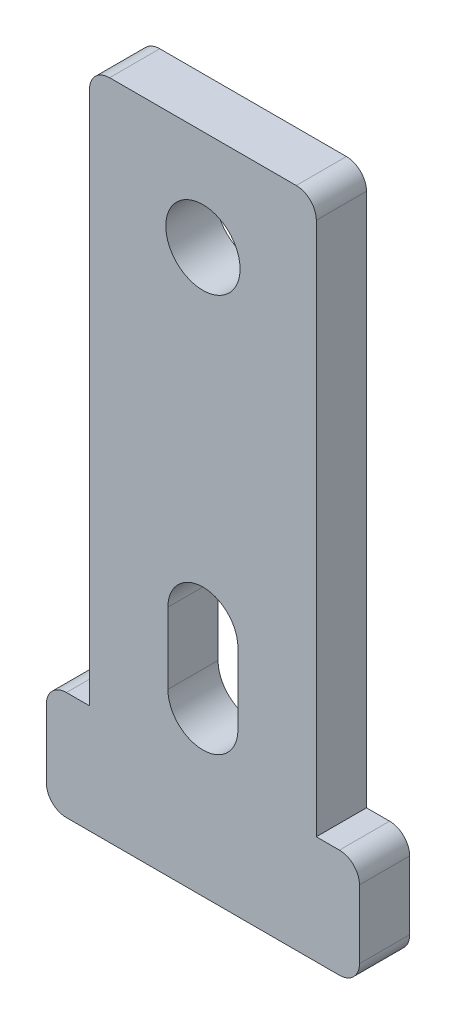
ISO-10303-21;
HEADER;
FILE_DESCRIPTION(('STEP AP214'),'2;1');
FILE_NAME('part.step','',(''),(''),'','','');
FILE_SCHEMA(('AUTOMOTIVE_DESIGN { 1 0 10303 214 1 1 1 1 }'));
ENDSEC;
DATA;
#1=APPLICATION_CONTEXT('core data for automotive mechanical design processes');
#2=APPLICATION_PROTOCOL_DEFINITION('international standard','automotive_design',2000,#1);
#3=PRODUCT_CONTEXT('',#1,'mechanical');
#4=PRODUCT('Part','Part','',(#3));
#5=PRODUCT_RELATED_PRODUCT_CATEGORY('part','',(#4));
#6=PRODUCT_DEFINITION_FORMATION('','',#4);
#7=PRODUCT_DEFINITION_CONTEXT('part definition',#1,'design');
#8=PRODUCT_DEFINITION('design','',#6,#7);
#9=PRODUCT_DEFINITION_SHAPE('','',#8);
#10=(LENGTH_UNIT() NAMED_UNIT(*) SI_UNIT(.MILLI.,.METRE.));
#11=(NAMED_UNIT(*) PLANE_ANGLE_UNIT() SI_UNIT($,.RADIAN.));
#12=(NAMED_UNIT(*) SI_UNIT($,.STERADIAN.) SOLID_ANGLE_UNIT());
#13=UNCERTAINTY_MEASURE_WITH_UNIT(LENGTH_MEASURE(1.E-05),#10,'distance_accuracy_value','');
#14=(GEOMETRIC_REPRESENTATION_CONTEXT(3) GLOBAL_UNCERTAINTY_ASSIGNED_CONTEXT((#13)) GLOBAL_UNIT_ASSIGNED_CONTEXT((#10,
#11,#12)) REPRESENTATION_CONTEXT('',''));
#15=CARTESIAN_POINT('',(0.,0.,0.));
#16=DIRECTION('',(0.,0.,1.));
#17=DIRECTION('',(1.,0.,0.));
#18=AXIS2_PLACEMENT_3D('',#15,#16,#17);
#19=CARTESIAN_POINT('',(0.,-11.1,2.5));
#20=DIRECTION('',(0.,1.,0.));
#21=DIRECTION('',(0.,0.,1.));
#22=AXIS2_PLACEMENT_3D('',#19,#20,#21);
#23=PLANE('',#22);
#24=DIRECTION('',(1.,0.,0.));
#25=VECTOR('',#24,1.);
#26=CARTESIAN_POINT('',(0.,-11.1,2.5));
#27=LINE('',#26,#25);
#28=CARTESIAN_POINT('',(5.65,-11.1,2.5));
#29=VERTEX_POINT('',#28);
#30=CARTESIAN_POINT('',(6.8,-11.1,2.5));
#31=VERTEX_POINT('',#30);
#32=EDGE_CURVE('E209',#29,#31,#27,.T.);
#33=ORIENTED_EDGE('',*,*,#32,.T.);
#34=DIRECTION('',(0.,0.,-1.));
#35=VECTOR('',#34,1.);
#36=CARTESIAN_POINT('',(6.8,-11.1,2.5));
#37=LINE('',#36,#35);
#38=CARTESIAN_POINT('',(6.8,-11.1,0.));
#39=VERTEX_POINT('',#38);
#40=EDGE_CURVE('E358',#31,#39,#37,.T.);
#41=ORIENTED_EDGE('',*,*,#40,.T.);
#42=DIRECTION('',(1.,0.,0.));
#43=VECTOR('',#42,1.);
#44=CARTESIAN_POINT('',(0.,-11.1,0.));
#45=LINE('',#44,#43);
#46=CARTESIAN_POINT('',(5.65,-11.1,0.));
#47=VERTEX_POINT('',#46);
#48=EDGE_CURVE('E257',#47,#39,#45,.T.);
#49=ORIENTED_EDGE('',*,*,#48,.F.);
#50=DIRECTION('',(0.,0.,-1.));
#51=VECTOR('',#50,1.);
#52=CARTESIAN_POINT('',(5.65,-11.1,2.5));
#53=LINE('',#52,#51);
#54=EDGE_CURVE('E290',#29,#47,#53,.T.);
#55=ORIENTED_EDGE('',*,*,#54,.F.);
#56=EDGE_LOOP('',(#33,#41,#49,#55));
#57=FACE_BOUND('',#56,.T.);
#58=ADVANCED_FACE('F41',(#57),#23,.T.);
#59=CARTESIAN_POINT('',(5.65,0.,2.5));
#60=DIRECTION('',(-1.,0.,0.));
#61=DIRECTION('',(0.,0.,1.));
#62=AXIS2_PLACEMENT_3D('',#59,#60,#61);
#63=PLANE('',#62);
#64=DIRECTION('',(0.,1.,0.));
#65=VECTOR('',#64,1.);
#66=CARTESIAN_POINT('',(5.65,0.,0.));
#67=LINE('',#66,#65);
#68=CARTESIAN_POINT('',(5.65,15.5,0.));
#69=VERTEX_POINT('',#68);
#70=EDGE_CURVE('E261',#47,#69,#67,.T.);
#71=ORIENTED_EDGE('',*,*,#70,.T.);
#72=DIRECTION('',(0.,0.,-1.));
#73=VECTOR('',#72,1.);
#74=CARTESIAN_POINT('',(5.65,15.5,2.5));
#75=LINE('',#74,#73);
#76=CARTESIAN_POINT('',(5.65,15.5,2.5));
#77=VERTEX_POINT('',#76);
#78=EDGE_CURVE('E50',#69,#77,#75,.F.);
#79=ORIENTED_EDGE('',*,*,#78,.T.);
#80=DIRECTION('',(0.,1.,0.));
#81=VECTOR('',#80,1.);
#82=CARTESIAN_POINT('',(5.65,0.,2.5));
#83=LINE('',#82,#81);
#84=EDGE_CURVE('E213',#29,#77,#83,.T.);
#85=ORIENTED_EDGE('',*,*,#84,.F.);
#86=ORIENTED_EDGE('',*,*,#54,.T.);
#87=EDGE_LOOP('',(#71,#79,#85,#86));
#88=FACE_BOUND('',#87,.T.);
#89=ADVANCED_FACE('F372',(#88),#63,.F.);
#90=CARTESIAN_POINT('',(0.,16.5,2.5));
#91=DIRECTION('',(0.,1.,0.));
#92=DIRECTION('',(0.,0.,1.));
#93=AXIS2_PLACEMENT_3D('',#90,#91,#92);
#94=PLANE('',#93);
#95=DIRECTION('',(1.,0.,0.));
#96=VECTOR('',#95,1.);
#97=CARTESIAN_POINT('',(0.,16.5,2.5));
#98=LINE('',#97,#96);
#99=CARTESIAN_POINT('',(-4.65,16.5,2.5));
#100=VERTEX_POINT('',#99);
#101=CARTESIAN_POINT('',(4.65,16.5,2.5));
#102=VERTEX_POINT('',#101);
#103=EDGE_CURVE('E217',#100,#102,#98,.T.);
#104=ORIENTED_EDGE('',*,*,#103,.T.);
#105=DIRECTION('',(0.,0.,-1.));
#106=VECTOR('',#105,1.);
#107=CARTESIAN_POINT('',(4.65,16.5,0.));
#108=LINE('',#107,#106);
#109=CARTESIAN_POINT('',(4.65,16.5,0.));
#110=VERTEX_POINT('',#109);
#111=EDGE_CURVE('E365',#102,#110,#108,.T.);
#112=ORIENTED_EDGE('',*,*,#111,.T.);
#113=DIRECTION('',(1.,0.,0.));
#114=VECTOR('',#113,1.);
#115=CARTESIAN_POINT('',(0.,16.5,0.));
#116=LINE('',#115,#114);
#117=CARTESIAN_POINT('',(-4.65,16.5,0.));
#118=VERTEX_POINT('',#117);
#119=EDGE_CURVE('E265',#118,#110,#116,.T.);
#120=ORIENTED_EDGE('',*,*,#119,.F.);
#121=DIRECTION('',(0.,0.,-1.));
#122=VECTOR('',#121,1.);
#123=CARTESIAN_POINT('',(-4.65,16.5,2.5));
#124=LINE('',#123,#122);
#125=EDGE_CURVE('E362',#118,#100,#124,.F.);
#126=ORIENTED_EDGE('',*,*,#125,.T.);
#127=EDGE_LOOP('',(#104,#112,#120,#126));
#128=FACE_BOUND('',#127,.T.);
#129=ADVANCED_FACE('F383',(#128),#94,.T.);
#130=CARTESIAN_POINT('',(-5.65,0.,2.5));
#131=DIRECTION('',(-1.,0.,0.));
#132=DIRECTION('',(0.,0.,1.));
#133=AXIS2_PLACEMENT_3D('',#130,#131,#132);
#134=PLANE('',#133);
#135=DIRECTION('',(0.,1.,0.));
#136=VECTOR('',#135,1.);
#137=CARTESIAN_POINT('',(-5.65,0.,2.5));
#138=LINE('',#137,#136);
#139=CARTESIAN_POINT('',(-5.65,-11.1,2.5));
#140=VERTEX_POINT('',#139);
#141=CARTESIAN_POINT('',(-5.65,15.5,2.5));
#142=VERTEX_POINT('',#141);
#143=EDGE_CURVE('E221',#140,#142,#138,.T.);
#144=ORIENTED_EDGE('',*,*,#143,.T.);
#145=DIRECTION('',(0.,0.,-1.));
#146=VECTOR('',#145,1.);
#147=CARTESIAN_POINT('',(-5.65,15.5,2.5));
#148=LINE('',#147,#146);
#149=CARTESIAN_POINT('',(-5.65,15.5,0.));
#150=VERTEX_POINT('',#149);
#151=EDGE_CURVE('E11',#142,#150,#148,.T.);
#152=ORIENTED_EDGE('',*,*,#151,.T.);
#153=DIRECTION('',(0.,1.,0.));
#154=VECTOR('',#153,1.);
#155=CARTESIAN_POINT('',(-5.65,0.,0.));
#156=LINE('',#155,#154);
#157=CARTESIAN_POINT('',(-5.65,-11.1,0.));
#158=VERTEX_POINT('',#157);
#159=EDGE_CURVE('E269',#158,#150,#156,.T.);
#160=ORIENTED_EDGE('',*,*,#159,.F.);
#161=DIRECTION('',(0.,0.,-1.));
#162=VECTOR('',#161,1.);
#163=CARTESIAN_POINT('',(-5.65,-11.1,2.5));
#164=LINE('',#163,#162);
#165=EDGE_CURVE('E180',#140,#158,#164,.T.);
#166=ORIENTED_EDGE('',*,*,#165,.F.);
#167=EDGE_LOOP('',(#144,#152,#160,#166));
#168=FACE_BOUND('',#167,.T.);
#169=ADVANCED_FACE('F392',(#168),#134,.T.);
#170=CARTESIAN_POINT('',(0.,-11.1,2.5));
#171=DIRECTION('',(0.,1.,0.));
#172=DIRECTION('',(0.,0.,1.));
#173=AXIS2_PLACEMENT_3D('',#170,#171,#172);
#174=PLANE('',#173);
#175=DIRECTION('',(1.,0.,0.));
#176=VECTOR('',#175,1.);
#177=CARTESIAN_POINT('',(0.,-11.1,0.));
#178=LINE('',#177,#176);
#179=CARTESIAN_POINT('',(-6.8,-11.1,0.));
#180=VERTEX_POINT('',#179);
#181=EDGE_CURVE('E273',#180,#158,#178,.T.);
#182=ORIENTED_EDGE('',*,*,#181,.F.);
#183=DIRECTION('',(0.,0.,-1.));
#184=VECTOR('',#183,1.);
#185=CARTESIAN_POINT('',(-6.8,-11.1,2.5));
#186=LINE('',#185,#184);
#187=CARTESIAN_POINT('',(-6.8,-11.1,2.5));
#188=VERTEX_POINT('',#187);
#189=EDGE_CURVE('E349',#180,#188,#186,.F.);
#190=ORIENTED_EDGE('',*,*,#189,.T.);
#191=DIRECTION('',(1.,0.,0.));
#192=VECTOR('',#191,1.);
#193=CARTESIAN_POINT('',(0.,-11.1,2.5));
#194=LINE('',#193,#192);
#195=EDGE_CURVE('E225',#188,#140,#194,.T.);
#196=ORIENTED_EDGE('',*,*,#195,.T.);
#197=ORIENTED_EDGE('',*,*,#165,.T.);
#198=EDGE_LOOP('',(#182,#190,#196,#197));
#199=FACE_BOUND('',#198,.T.);
#200=ADVANCED_FACE('F535',(#199),#174,.T.);
#201=CARTESIAN_POINT('',(-7.8,0.,2.5));
#202=DIRECTION('',(-1.,0.,0.));
#203=DIRECTION('',(0.,0.,1.));
#204=AXIS2_PLACEMENT_3D('',#201,#202,#203);
#205=PLANE('',#204);
#206=DIRECTION('',(0.,1.,0.));
#207=VECTOR('',#206,1.);
#208=CARTESIAN_POINT('',(-7.8,0.,0.));
#209=LINE('',#208,#207);
#210=CARTESIAN_POINT('',(-7.8,-15.5,0.));
#211=VERTEX_POINT('',#210);
#212=CARTESIAN_POINT('',(-7.8,-12.1,0.));
#213=VERTEX_POINT('',#212);
#214=EDGE_CURVE('E276',#211,#213,#209,.T.);
#215=ORIENTED_EDGE('',*,*,#214,.F.);
#216=DIRECTION('',(0.,0.,-1.));
#217=VECTOR('',#216,1.);
#218=CARTESIAN_POINT('',(-7.8,-15.5,2.5));
#219=LINE('',#218,#217);
#220=CARTESIAN_POINT('',(-7.8,-15.5,2.5));
#221=VERTEX_POINT('',#220);
#222=EDGE_CURVE('E329',#211,#221,#219,.F.);
#223=ORIENTED_EDGE('',*,*,#222,.T.);
#224=DIRECTION('',(0.,1.,0.));
#225=VECTOR('',#224,1.);
#226=CARTESIAN_POINT('',(-7.8,0.,2.5));
#227=LINE('',#226,#225);
#228=CARTESIAN_POINT('',(-7.8,-12.1,2.5));
#229=VERTEX_POINT('',#228);
#230=EDGE_CURVE('E228',#221,#229,#227,.T.);
#231=ORIENTED_EDGE('',*,*,#230,.T.);
#232=DIRECTION('',(0.,0.,-1.));
#233=VECTOR('',#232,1.);
#234=CARTESIAN_POINT('',(-7.8,-12.1,2.5));
#235=LINE('',#234,#233);
#236=EDGE_CURVE('E325',#229,#213,#235,.T.);
#237=ORIENTED_EDGE('',*,*,#236,.T.);
#238=EDGE_LOOP('',(#215,#223,#231,#237));
#239=FACE_BOUND('',#238,.T.);
#240=ADVANCED_FACE('F404',(#239),#205,.T.);
#241=CARTESIAN_POINT('',(0.,-16.5,2.5));
#242=DIRECTION('',(0.,-1.,0.));
#243=DIRECTION('',(0.,0.,-1.));
#244=AXIS2_PLACEMENT_3D('',#241,#242,#243);
#245=PLANE('',#244);
#246=DIRECTION('',(-1.,0.,0.));
#247=VECTOR('',#246,1.);
#248=CARTESIAN_POINT('',(0.,-16.5,2.5));
#249=LINE('',#248,#247);
#250=CARTESIAN_POINT('',(6.8,-16.5,2.5));
#251=VERTEX_POINT('',#250);
#252=CARTESIAN_POINT('',(-6.8,-16.5,2.5));
#253=VERTEX_POINT('',#252);
#254=EDGE_CURVE('E232',#251,#253,#249,.T.);
#255=ORIENTED_EDGE('',*,*,#254,.T.);
#256=DIRECTION('',(0.,0.,-1.));
#257=VECTOR('',#256,1.);
#258=CARTESIAN_POINT('',(-6.8,-16.5,2.5));
#259=LINE('',#258,#257);
#260=CARTESIAN_POINT('',(-6.8,-16.5,0.));
#261=VERTEX_POINT('',#260);
#262=EDGE_CURVE('E303',#253,#261,#259,.T.);
#263=ORIENTED_EDGE('',*,*,#262,.T.);
#264=DIRECTION('',(-1.,0.,0.));
#265=VECTOR('',#264,1.);
#266=CARTESIAN_POINT('',(0.,-16.5,0.));
#267=LINE('',#266,#265);
#268=CARTESIAN_POINT('',(6.8,-16.5,0.));
#269=VERTEX_POINT('',#268);
#270=EDGE_CURVE('E280',#269,#261,#267,.T.);
#271=ORIENTED_EDGE('',*,*,#270,.F.);
#272=DIRECTION('',(0.,0.,-1.));
#273=VECTOR('',#272,1.);
#274=CARTESIAN_POINT('',(6.8,-16.5,2.5));
#275=LINE('',#274,#273);
#276=EDGE_CURVE('E293',#269,#251,#275,.F.);
#277=ORIENTED_EDGE('',*,*,#276,.T.);
#278=EDGE_LOOP('',(#255,#263,#271,#277));
#279=FACE_BOUND('',#278,.T.);
#280=ADVANCED_FACE('F413',(#279),#245,.T.);
#281=CARTESIAN_POINT('',(0.,-4.89338309242175,2.5));
#282=DIRECTION('',(0.,0.,-1.));
#283=DIRECTION('',(-1.,0.,0.));
#284=AXIS2_PLACEMENT_3D('',#281,#282,#283);
#285=CYLINDRICAL_SURFACE('',#284,1.74449319310327);
#286=CARTESIAN_POINT('',(0.,-4.89338309242175,0.));
#287=DIRECTION('',(0.,0.,1.));
#288=DIRECTION('',(1.,0.,0.));
#289=AXIS2_PLACEMENT_3D('',#286,#287,#288);
#290=CIRCLE('',#289,1.74449319310327);
#291=CARTESIAN_POINT('',(1.74449319310327,-4.89338309242175,0.));
#292=VERTEX_POINT('',#291);
#293=CARTESIAN_POINT('',(-1.74449319310327,-4.89338309242175,0.));
#294=VERTEX_POINT('',#293);
#295=EDGE_CURVE('E174',#292,#294,#290,.T.);
#296=ORIENTED_EDGE('',*,*,#295,.F.);
#297=DIRECTION('',(0.,0.,-1.));
#298=VECTOR('',#297,1.);
#299=CARTESIAN_POINT('',(1.74449319310327,-4.89338309242175,2.5));
#300=LINE('',#299,#298);
#301=CARTESIAN_POINT('',(1.74449319310327,-4.89338309242175,2.5));
#302=VERTEX_POINT('',#301);
#303=EDGE_CURVE('E169',#302,#292,#300,.T.);
#304=ORIENTED_EDGE('',*,*,#303,.F.);
#305=CARTESIAN_POINT('',(0.,-4.89338309242175,2.5));
#306=DIRECTION('',(0.,0.,1.));
#307=DIRECTION('',(1.,0.,0.));
#308=AXIS2_PLACEMENT_3D('',#305,#306,#307);
#309=CIRCLE('',#308,1.74449319310327);
#310=CARTESIAN_POINT('',(-1.74449319310327,-4.89338309242175,2.5));
#311=VERTEX_POINT('',#310);
#312=EDGE_CURVE('E172',#302,#311,#309,.T.);
#313=ORIENTED_EDGE('',*,*,#312,.T.);
#314=DIRECTION('',(0.,0.,-1.));
#315=VECTOR('',#314,1.);
#316=CARTESIAN_POINT('',(-1.74449319310327,-4.89338309242175,2.5));
#317=LINE('',#316,#315);
#318=EDGE_CURVE('E239',#311,#294,#317,.T.);
#319=ORIENTED_EDGE('',*,*,#318,.T.);
#320=EDGE_LOOP('',(#296,#304,#313,#319));
#321=FACE_BOUND('',#320,.T.);
#322=ADVANCED_FACE('F171',(#321),#285,.F.);
#323=CARTESIAN_POINT('',(1.74449319310327,0.,2.5));
#324=DIRECTION('',(-1.,0.,0.));
#325=DIRECTION('',(0.,-1.,0.));
#326=AXIS2_PLACEMENT_3D('',#323,#324,#325);
#327=PLANE('',#326);
#328=DIRECTION('',(0.,1.,0.));
#329=VECTOR('',#328,1.);
#330=CARTESIAN_POINT('',(1.74449319310327,0.,0.));
#331=LINE('',#330,#329);
#332=CARTESIAN_POINT('',(1.74449319310327,-8.43596580277362,0.));
#333=VERTEX_POINT('',#332);
#334=EDGE_CURVE('E242',#333,#292,#331,.T.);
#335=ORIENTED_EDGE('',*,*,#334,.F.);
#336=DIRECTION('',(0.,0.,-1.));
#337=VECTOR('',#336,1.);
#338=CARTESIAN_POINT('',(1.74449319310327,-8.43596580277362,2.5));
#339=LINE('',#338,#337);
#340=CARTESIAN_POINT('',(1.74449319310327,-8.43596580277362,2.5));
#341=VERTEX_POINT('',#340);
#342=EDGE_CURVE('E181',#341,#333,#339,.T.);
#343=ORIENTED_EDGE('',*,*,#342,.F.);
#344=DIRECTION('',(0.,1.,0.));
#345=VECTOR('',#344,1.);
#346=CARTESIAN_POINT('',(1.74449319310327,0.,2.5));
#347=LINE('',#346,#345);
#348=EDGE_CURVE('E188',#341,#302,#347,.T.);
#349=ORIENTED_EDGE('',*,*,#348,.T.);
#350=ORIENTED_EDGE('',*,*,#303,.T.);
#351=EDGE_LOOP('',(#335,#343,#349,#350));
#352=FACE_BOUND('',#351,.T.);
#353=ADVANCED_FACE('F196',(#352),#327,.T.);
#354=CARTESIAN_POINT('',(0.,-8.43596580277362,2.5));
#355=DIRECTION('',(0.,0.,-1.));
#356=DIRECTION('',(-1.,0.,0.));
#357=AXIS2_PLACEMENT_3D('',#354,#355,#356);
#358=CYLINDRICAL_SURFACE('',#357,1.74449319310327);
#359=CARTESIAN_POINT('',(0.,-8.43596580277362,0.));
#360=DIRECTION('',(0.,0.,1.));
#361=DIRECTION('',(1.,0.,0.));
#362=AXIS2_PLACEMENT_3D('',#359,#360,#361);
#363=CIRCLE('',#362,1.74449319310327);
#364=CARTESIAN_POINT('',(-1.74449319310327,-8.43596580277362,0.));
#365=VERTEX_POINT('',#364);
#366=EDGE_CURVE('E245',#365,#333,#363,.T.);
#367=ORIENTED_EDGE('',*,*,#366,.F.);
#368=DIRECTION('',(0.,0.,-1.));
#369=VECTOR('',#368,1.);
#370=CARTESIAN_POINT('',(-1.74449319310327,-8.43596580277362,2.5));
#371=LINE('',#370,#369);
#372=CARTESIAN_POINT('',(-1.74449319310327,-8.43596580277362,2.5));
#373=VERTEX_POINT('',#372);
#374=EDGE_CURVE('E296',#373,#365,#371,.T.);
#375=ORIENTED_EDGE('',*,*,#374,.F.);
#376=CARTESIAN_POINT('',(0.,-8.43596580277362,2.5));
#377=DIRECTION('',(0.,0.,1.));
#378=DIRECTION('',(1.,0.,0.));
#379=AXIS2_PLACEMENT_3D('',#376,#377,#378);
#380=CIRCLE('',#379,1.74449319310327);
#381=EDGE_CURVE('E198',#373,#341,#380,.T.);
#382=ORIENTED_EDGE('',*,*,#381,.T.);
#383=ORIENTED_EDGE('',*,*,#342,.T.);
#384=EDGE_LOOP('',(#367,#375,#382,#383));
#385=FACE_BOUND('',#384,.T.);
#386=ADVANCED_FACE('F437',(#385),#358,.F.);
#387=CARTESIAN_POINT('',(0.,11.5,2.5));
#388=DIRECTION('',(0.,0.,-1.));
#389=DIRECTION('',(-1.,0.,0.));
#390=AXIS2_PLACEMENT_3D('',#387,#388,#389);
#391=CYLINDRICAL_SURFACE('',#390,1.85);
#392=CARTESIAN_POINT('',(0.,11.5,2.5));
#393=DIRECTION('',(0.,0.,1.));
#394=DIRECTION('',(1.,0.,0.));
#395=AXIS2_PLACEMENT_3D('',#392,#393,#394);
#396=CIRCLE('',#395,1.85);
#397=CARTESIAN_POINT('',(1.85,11.5,2.5));
#398=VERTEX_POINT('',#397);
#399=EDGE_CURVE('E205',#398,#398,#396,.T.);
#400=ORIENTED_EDGE('',*,*,#399,.T.);
#401=EDGE_LOOP('',(#400));
#402=FACE_BOUND('',#401,.T.);
#403=CARTESIAN_POINT('',(0.,11.5,0.));
#404=DIRECTION('',(0.,0.,1.));
#405=DIRECTION('',(1.,0.,0.));
#406=AXIS2_PLACEMENT_3D('',#403,#404,#405);
#407=CIRCLE('',#406,1.85);
#408=CARTESIAN_POINT('',(1.85,11.5,0.));
#409=VERTEX_POINT('',#408);
#410=EDGE_CURVE('E253',#409,#409,#407,.T.);
#411=ORIENTED_EDGE('',*,*,#410,.F.);
#412=EDGE_LOOP('',(#411));
#413=FACE_BOUND('',#412,.T.);
#414=ADVANCED_FACE('F433',(#402,#413),#391,.F.);
#415=CARTESIAN_POINT('',(-1.74449319310327,0.,2.5));
#416=DIRECTION('',(-1.,0.,0.));
#417=DIRECTION('',(0.,-1.,0.));
#418=AXIS2_PLACEMENT_3D('',#415,#416,#417);
#419=PLANE('',#418);
#420=DIRECTION('',(0.,1.,0.));
#421=VECTOR('',#420,1.);
#422=CARTESIAN_POINT('',(-1.74449319310327,0.,0.));
#423=LINE('',#422,#421);
#424=EDGE_CURVE('E249',#365,#294,#423,.T.);
#425=ORIENTED_EDGE('',*,*,#424,.T.);
#426=ORIENTED_EDGE('',*,*,#318,.F.);
#427=DIRECTION('',(0.,1.,0.));
#428=VECTOR('',#427,1.);
#429=CARTESIAN_POINT('',(-1.74449319310327,0.,2.5));
#430=LINE('',#429,#428);
#431=EDGE_CURVE('E191',#373,#311,#430,.T.);
#432=ORIENTED_EDGE('',*,*,#431,.F.);
#433=ORIENTED_EDGE('',*,*,#374,.T.);
#434=EDGE_LOOP('',(#425,#426,#432,#433));
#435=FACE_BOUND('',#434,.T.);
#436=ADVANCED_FACE('F436',(#435),#419,.F.);
#437=CARTESIAN_POINT('',(7.8,0.,2.5));
#438=DIRECTION('',(1.,0.,0.));
#439=DIRECTION('',(0.,0.,-1.));
#440=AXIS2_PLACEMENT_3D('',#437,#438,#439);
#441=PLANE('',#440);
#442=DIRECTION('',(0.,-1.,0.));
#443=VECTOR('',#442,1.);
#444=CARTESIAN_POINT('',(7.8,0.,2.5));
#445=LINE('',#444,#443);
#446=CARTESIAN_POINT('',(7.8,-12.1,2.5));
#447=VERTEX_POINT('',#446);
#448=CARTESIAN_POINT('',(7.8,-15.5,2.5));
#449=VERTEX_POINT('',#448);
#450=EDGE_CURVE('E236',#447,#449,#445,.T.);
#451=ORIENTED_EDGE('',*,*,#450,.T.);
#452=DIRECTION('',(0.,0.,-1.));
#453=VECTOR('',#452,1.);
#454=CARTESIAN_POINT('',(7.8,-15.5,2.5));
#455=LINE('',#454,#453);
#456=CARTESIAN_POINT('',(7.8,-15.5,0.));
#457=VERTEX_POINT('',#456);
#458=EDGE_CURVE('E354',#449,#457,#455,.T.);
#459=ORIENTED_EDGE('',*,*,#458,.T.);
#460=DIRECTION('',(0.,-1.,0.));
#461=VECTOR('',#460,1.);
#462=CARTESIAN_POINT('',(7.8,0.,0.));
#463=LINE('',#462,#461);
#464=CARTESIAN_POINT('',(7.8,-12.1,0.));
#465=VERTEX_POINT('',#464);
#466=EDGE_CURVE('E194',#465,#457,#463,.T.);
#467=ORIENTED_EDGE('',*,*,#466,.F.);
#468=DIRECTION('',(0.,0.,-1.));
#469=VECTOR('',#468,1.);
#470=CARTESIAN_POINT('',(7.8,-12.1,2.5));
#471=LINE('',#470,#469);
#472=EDGE_CURVE('E64',#465,#447,#471,.F.);
#473=ORIENTED_EDGE('',*,*,#472,.T.);
#474=EDGE_LOOP('',(#451,#459,#467,#473));
#475=FACE_BOUND('',#474,.T.);
#476=ADVANCED_FACE('F418',(#475),#441,.T.);
#477=CARTESIAN_POINT('',(0.,0.,2.5));
#478=DIRECTION('',(0.,0.,1.));
#479=DIRECTION('',(1.,0.,0.));
#480=AXIS2_PLACEMENT_3D('',#477,#478,#479);
#481=PLANE('',#480);
#482=ORIENTED_EDGE('',*,*,#312,.F.);
#483=ORIENTED_EDGE('',*,*,#348,.F.);
#484=ORIENTED_EDGE('',*,*,#381,.F.);
#485=ORIENTED_EDGE('',*,*,#431,.T.);
#486=EDGE_LOOP('',(#482,#483,#484,#485));
#487=FACE_BOUND('',#486,.T.);
#488=ORIENTED_EDGE('',*,*,#399,.F.);
#489=EDGE_LOOP('',(#488));
#490=FACE_BOUND('',#489,.T.);
#491=ORIENTED_EDGE('',*,*,#230,.F.);
#492=CARTESIAN_POINT('',(-6.8,-15.5,2.5));
#493=DIRECTION('',(0.,0.,1.));
#494=DIRECTION('',(1.,0.,0.));
#495=AXIS2_PLACEMENT_3D('',#492,#493,#494);
#496=CIRCLE('',#495,1.);
#497=EDGE_CURVE('E346',#221,#253,#496,.T.);
#498=ORIENTED_EDGE('',*,*,#497,.T.);
#499=ORIENTED_EDGE('',*,*,#254,.F.);
#500=CARTESIAN_POINT('',(6.8,-15.5,2.5));
#501=DIRECTION('',(0.,0.,1.));
#502=DIRECTION('',(1.,0.,0.));
#503=AXIS2_PLACEMENT_3D('',#500,#501,#502);
#504=CIRCLE('',#503,1.);
#505=EDGE_CURVE('E57',#251,#449,#504,.T.);
#506=ORIENTED_EDGE('',*,*,#505,.T.);
#507=ORIENTED_EDGE('',*,*,#450,.F.);
#508=CARTESIAN_POINT('',(6.8,-12.1,2.5));
#509=DIRECTION('',(0.,0.,1.));
#510=DIRECTION('',(1.,0.,0.));
#511=AXIS2_PLACEMENT_3D('',#508,#509,#510);
#512=CIRCLE('',#511,1.);
#513=EDGE_CURVE('E338',#447,#31,#512,.T.);
#514=ORIENTED_EDGE('',*,*,#513,.T.);
#515=ORIENTED_EDGE('',*,*,#32,.F.);
#516=ORIENTED_EDGE('',*,*,#84,.T.);
#517=CARTESIAN_POINT('',(4.65,15.5,2.5));
#518=DIRECTION('',(0.,0.,1.));
#519=DIRECTION('',(1.,0.,0.));
#520=AXIS2_PLACEMENT_3D('',#517,#518,#519);
#521=CIRCLE('',#520,1.);
#522=EDGE_CURVE('E335',#77,#102,#521,.T.);
#523=ORIENTED_EDGE('',*,*,#522,.T.);
#524=ORIENTED_EDGE('',*,*,#103,.F.);
#525=CARTESIAN_POINT('',(-4.65,15.5,2.5));
#526=DIRECTION('',(0.,0.,1.));
#527=DIRECTION('',(1.,0.,0.));
#528=AXIS2_PLACEMENT_3D('',#525,#526,#527);
#529=CIRCLE('',#528,1.);
#530=EDGE_CURVE('E332',#100,#142,#529,.T.);
#531=ORIENTED_EDGE('',*,*,#530,.T.);
#532=ORIENTED_EDGE('',*,*,#143,.F.);
#533=ORIENTED_EDGE('',*,*,#195,.F.);
#534=CARTESIAN_POINT('',(-6.8,-12.1,2.5));
#535=DIRECTION('',(0.,0.,1.));
#536=DIRECTION('',(1.,0.,0.));
#537=AXIS2_PLACEMENT_3D('',#534,#535,#536);
#538=CIRCLE('',#537,1.);
#539=EDGE_CURVE('E343',#188,#229,#538,.T.);
#540=ORIENTED_EDGE('',*,*,#539,.T.);
#541=EDGE_LOOP('',(#491,#498,#499,#506,#507,#514,#515,#516,#523,#524,#531,#532,#533,#540));
#542=FACE_BOUND('',#541,.T.);
#543=ADVANCED_FACE('F185',(#487,#490,#542),#481,.T.);
#544=CARTESIAN_POINT('',(0.,0.,0.));
#545=DIRECTION('',(0.,0.,1.));
#546=DIRECTION('',(1.,0.,0.));
#547=AXIS2_PLACEMENT_3D('',#544,#545,#546);
#548=PLANE('',#547);
#549=ORIENTED_EDGE('',*,*,#295,.T.);
#550=ORIENTED_EDGE('',*,*,#424,.F.);
#551=ORIENTED_EDGE('',*,*,#366,.T.);
#552=ORIENTED_EDGE('',*,*,#334,.T.);
#553=EDGE_LOOP('',(#549,#550,#551,#552));
#554=FACE_BOUND('',#553,.T.);
#555=ORIENTED_EDGE('',*,*,#410,.T.);
#556=EDGE_LOOP('',(#555));
#557=FACE_BOUND('',#556,.T.);
#558=ORIENTED_EDGE('',*,*,#270,.T.);
#559=CARTESIAN_POINT('',(-6.8,-15.5,0.));
#560=DIRECTION('',(0.,0.,1.));
#561=DIRECTION('',(1.,0.,0.));
#562=AXIS2_PLACEMENT_3D('',#559,#560,#561);
#563=CIRCLE('',#562,1.);
#564=EDGE_CURVE('E322',#261,#211,#563,.F.);
#565=ORIENTED_EDGE('',*,*,#564,.T.);
#566=ORIENTED_EDGE('',*,*,#214,.T.);
#567=CARTESIAN_POINT('',(-6.8,-12.1,0.));
#568=DIRECTION('',(0.,0.,1.));
#569=DIRECTION('',(1.,0.,0.));
#570=AXIS2_PLACEMENT_3D('',#567,#568,#569);
#571=CIRCLE('',#570,1.);
#572=EDGE_CURVE('E319',#213,#180,#571,.F.);
#573=ORIENTED_EDGE('',*,*,#572,.T.);
#574=ORIENTED_EDGE('',*,*,#181,.T.);
#575=ORIENTED_EDGE('',*,*,#159,.T.);
#576=CARTESIAN_POINT('',(-4.65,15.5,0.));
#577=DIRECTION('',(0.,0.,1.));
#578=DIRECTION('',(1.,0.,0.));
#579=AXIS2_PLACEMENT_3D('',#576,#577,#578);
#580=CIRCLE('',#579,1.);
#581=EDGE_CURVE('E307',#150,#118,#580,.F.);
#582=ORIENTED_EDGE('',*,*,#581,.T.);
#583=ORIENTED_EDGE('',*,*,#119,.T.);
#584=CARTESIAN_POINT('',(4.65,15.5,0.));
#585=DIRECTION('',(0.,0.,1.));
#586=DIRECTION('',(1.,0.,0.));
#587=AXIS2_PLACEMENT_3D('',#584,#585,#586);
#588=CIRCLE('',#587,1.);
#589=EDGE_CURVE('E310',#110,#69,#588,.F.);
#590=ORIENTED_EDGE('',*,*,#589,.T.);
#591=ORIENTED_EDGE('',*,*,#70,.F.);
#592=ORIENTED_EDGE('',*,*,#48,.T.);
#593=CARTESIAN_POINT('',(6.8,-12.1,0.));
#594=DIRECTION('',(0.,0.,1.));
#595=DIRECTION('',(1.,0.,0.));
#596=AXIS2_PLACEMENT_3D('',#593,#594,#595);
#597=CIRCLE('',#596,1.);
#598=EDGE_CURVE('E313',#39,#465,#597,.F.);
#599=ORIENTED_EDGE('',*,*,#598,.T.);
#600=ORIENTED_EDGE('',*,*,#466,.T.);
#601=CARTESIAN_POINT('',(6.8,-15.5,0.));
#602=DIRECTION('',(0.,0.,1.));
#603=DIRECTION('',(1.,0.,0.));
#604=AXIS2_PLACEMENT_3D('',#601,#602,#603);
#605=CIRCLE('',#604,1.);
#606=EDGE_CURVE('E316',#457,#269,#605,.F.);
#607=ORIENTED_EDGE('',*,*,#606,.T.);
#608=EDGE_LOOP('',(#558,#565,#566,#573,#574,#575,#582,#583,#590,#591,#592,#599,#600,#607));
#609=FACE_BOUND('',#608,.T.);
#610=ADVANCED_FACE('F386',(#554,#557,#609),#548,.F.);
#611=CARTESIAN_POINT('',(-6.8,-15.5,2.5));
#612=DIRECTION('',(0.,0.,-1.));
#613=DIRECTION('',(-1.,0.,0.));
#614=AXIS2_PLACEMENT_3D('',#611,#612,#613);
#615=CYLINDRICAL_SURFACE('',#614,1.);
#616=ORIENTED_EDGE('',*,*,#497,.F.);
#617=ORIENTED_EDGE('',*,*,#222,.F.);
#618=ORIENTED_EDGE('',*,*,#564,.F.);
#619=ORIENTED_EDGE('',*,*,#262,.F.);
#620=EDGE_LOOP('',(#616,#617,#618,#619));
#621=FACE_BOUND('',#620,.T.);
#622=ADVANCED_FACE('F411',(#621),#615,.T.);
#623=CARTESIAN_POINT('',(-6.8,-12.1,2.5));
#624=DIRECTION('',(0.,0.,-1.));
#625=DIRECTION('',(-1.,0.,0.));
#626=AXIS2_PLACEMENT_3D('',#623,#624,#625);
#627=CYLINDRICAL_SURFACE('',#626,1.);
#628=ORIENTED_EDGE('',*,*,#539,.F.);
#629=ORIENTED_EDGE('',*,*,#189,.F.);
#630=ORIENTED_EDGE('',*,*,#572,.F.);
#631=ORIENTED_EDGE('',*,*,#236,.F.);
#632=EDGE_LOOP('',(#628,#629,#630,#631));
#633=FACE_BOUND('',#632,.T.);
#634=ADVANCED_FACE('F401',(#633),#627,.T.);
#635=CARTESIAN_POINT('',(6.8,-15.5,2.5));
#636=DIRECTION('',(0.,0.,-1.));
#637=DIRECTION('',(-1.,0.,0.));
#638=AXIS2_PLACEMENT_3D('',#635,#636,#637);
#639=CYLINDRICAL_SURFACE('',#638,1.);
#640=ORIENTED_EDGE('',*,*,#505,.F.);
#641=ORIENTED_EDGE('',*,*,#276,.F.);
#642=ORIENTED_EDGE('',*,*,#606,.F.);
#643=ORIENTED_EDGE('',*,*,#458,.F.);
#644=EDGE_LOOP('',(#640,#641,#642,#643));
#645=FACE_BOUND('',#644,.T.);
#646=ADVANCED_FACE('F417',(#645),#639,.T.);
#647=CARTESIAN_POINT('',(6.8,-12.1,2.5));
#648=DIRECTION('',(0.,0.,-1.));
#649=DIRECTION('',(-1.,0.,0.));
#650=AXIS2_PLACEMENT_3D('',#647,#648,#649);
#651=CYLINDRICAL_SURFACE('',#650,1.);
#652=ORIENTED_EDGE('',*,*,#513,.F.);
#653=ORIENTED_EDGE('',*,*,#472,.F.);
#654=ORIENTED_EDGE('',*,*,#598,.F.);
#655=ORIENTED_EDGE('',*,*,#40,.F.);
#656=EDGE_LOOP('',(#652,#653,#654,#655));
#657=FACE_BOUND('',#656,.T.);
#658=ADVANCED_FACE('F423',(#657),#651,.T.);
#659=CARTESIAN_POINT('',(4.65,15.5,2.5));
#660=DIRECTION('',(0.,0.,1.));
#661=DIRECTION('',(1.,0.,0.));
#662=AXIS2_PLACEMENT_3D('',#659,#660,#661);
#663=CYLINDRICAL_SURFACE('',#662,1.);
#664=ORIENTED_EDGE('',*,*,#522,.F.);
#665=ORIENTED_EDGE('',*,*,#78,.F.);
#666=ORIENTED_EDGE('',*,*,#589,.F.);
#667=ORIENTED_EDGE('',*,*,#111,.F.);
#668=EDGE_LOOP('',(#664,#665,#666,#667));
#669=FACE_BOUND('',#668,.T.);
#670=ADVANCED_FACE('F380',(#669),#663,.T.);
#671=CARTESIAN_POINT('',(-4.65,15.5,2.5));
#672=DIRECTION('',(0.,0.,-1.));
#673=DIRECTION('',(-1.,0.,0.));
#674=AXIS2_PLACEMENT_3D('',#671,#672,#673);
#675=CYLINDRICAL_SURFACE('',#674,1.);
#676=ORIENTED_EDGE('',*,*,#530,.F.);
#677=ORIENTED_EDGE('',*,*,#125,.F.);
#678=ORIENTED_EDGE('',*,*,#581,.F.);
#679=ORIENTED_EDGE('',*,*,#151,.F.);
#680=EDGE_LOOP('',(#676,#677,#678,#679));
#681=FACE_BOUND('',#680,.T.);
#682=ADVANCED_FACE('F43',(#681),#675,.T.);
#683=CLOSED_SHELL('',(#58,#89,#129,#169,#200,#240,#280,#322,#353,#386,#414,#436,#476,#543,#610,
#622,#634,#646,#658,#670,#682));
#684=MANIFOLD_SOLID_BREP('B2',#683);
#685=ADVANCED_BREP_SHAPE_REPRESENTATION('',(#18,#684),#14);
#686=SHAPE_DEFINITION_REPRESENTATION(#9,#685);
ENDSEC;
END-ISO-10303-21;
